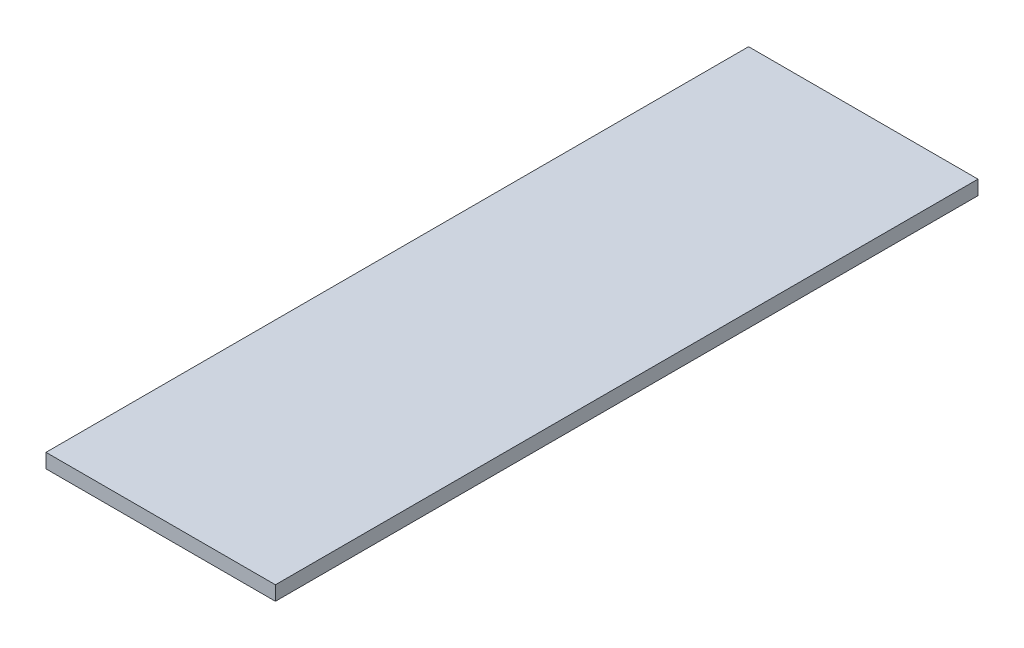
ISO-10303-21;
HEADER;
FILE_DESCRIPTION(('STEP AP214'),'2;1');
FILE_NAME('part.step','',(''),(''),'','','');
FILE_SCHEMA(('AUTOMOTIVE_DESIGN { 1 0 10303 214 1 1 1 1 }'));
ENDSEC;
DATA;
#1=APPLICATION_CONTEXT('core data for automotive mechanical design processes');
#2=APPLICATION_PROTOCOL_DEFINITION('international standard','automotive_design',2000,#1);
#3=PRODUCT_CONTEXT('',#1,'mechanical');
#4=PRODUCT('Part','Part','',(#3));
#5=PRODUCT_RELATED_PRODUCT_CATEGORY('part','',(#4));
#6=PRODUCT_DEFINITION_FORMATION('','',#4);
#7=PRODUCT_DEFINITION_CONTEXT('part definition',#1,'design');
#8=PRODUCT_DEFINITION('design','',#6,#7);
#9=PRODUCT_DEFINITION_SHAPE('','',#8);
#10=(LENGTH_UNIT() NAMED_UNIT(*) SI_UNIT(.MILLI.,.METRE.));
#11=(NAMED_UNIT(*) PLANE_ANGLE_UNIT() SI_UNIT($,.RADIAN.));
#12=(NAMED_UNIT(*) SI_UNIT($,.STERADIAN.) SOLID_ANGLE_UNIT());
#13=UNCERTAINTY_MEASURE_WITH_UNIT(LENGTH_MEASURE(1.E-05),#10,'distance_accuracy_value','');
#14=(GEOMETRIC_REPRESENTATION_CONTEXT(3) GLOBAL_UNCERTAINTY_ASSIGNED_CONTEXT((#13)) GLOBAL_UNIT_ASSIGNED_CONTEXT((#10,
#11,#12)) REPRESENTATION_CONTEXT('',''));
#15=CARTESIAN_POINT('',(0.,0.,0.));
#16=DIRECTION('',(0.,0.,1.));
#17=DIRECTION('',(1.,0.,0.));
#18=AXIS2_PLACEMENT_3D('',#15,#16,#17);
#19=CARTESIAN_POINT('',(1199.99999999998,-150.,-300.000000000034));
#20=DIRECTION('',(1.,0.,0.));
#21=DIRECTION('',(0.,0.,-1.));
#22=AXIS2_PLACEMENT_3D('',#19,#20,#21);
#23=PLANE('',#22);
#24=DIRECTION('',(0.,0.,-1.));
#25=VECTOR('',#24,1.);
#26=CARTESIAN_POINT('',(1199.99999999998,0.,-300.000000000034));
#27=LINE('',#26,#25);
#28=CARTESIAN_POINT('',(1199.99999999998,0.,7049.99999999999));
#29=VERTEX_POINT('',#28);
#30=CARTESIAN_POINT('',(1199.99999999998,0.,-300.000000000034));
#31=VERTEX_POINT('',#30);
#32=EDGE_CURVE('E107',#29,#31,#27,.T.);
#33=ORIENTED_EDGE('',*,*,#32,.F.);
#34=DIRECTION('',(0.,1.,0.));
#35=VECTOR('',#34,1.);
#36=CARTESIAN_POINT('',(1199.99999999998,-150.,7049.99999999999));
#37=LINE('',#36,#35);
#38=CARTESIAN_POINT('',(1199.99999999998,-150.,7049.99999999999));
#39=VERTEX_POINT('',#38);
#40=EDGE_CURVE('E11',#39,#29,#37,.T.);
#41=ORIENTED_EDGE('',*,*,#40,.F.);
#42=DIRECTION('',(0.,0.,-1.));
#43=VECTOR('',#42,1.);
#44=CARTESIAN_POINT('',(1199.99999999998,-150.,-300.000000000034));
#45=LINE('',#44,#43);
#46=CARTESIAN_POINT('',(1199.99999999998,-150.,-300.000000000034));
#47=VERTEX_POINT('',#46);
#48=EDGE_CURVE('E98',#39,#47,#45,.T.);
#49=ORIENTED_EDGE('',*,*,#48,.T.);
#50=DIRECTION('',(0.,1.,0.));
#51=VECTOR('',#50,1.);
#52=CARTESIAN_POINT('',(1199.99999999998,-150.,-300.000000000034));
#53=LINE('',#52,#51);
#54=EDGE_CURVE('E39',#47,#31,#53,.T.);
#55=ORIENTED_EDGE('',*,*,#54,.T.);
#56=EDGE_LOOP('',(#33,#41,#49,#55));
#57=FACE_BOUND('',#56,.T.);
#58=ADVANCED_FACE('F36',(#57),#23,.T.);
#59=CARTESIAN_POINT('',(1199.99999999998,-150.,7049.99999999999));
#60=DIRECTION('',(0.,0.,1.));
#61=DIRECTION('',(1.,0.,0.));
#62=AXIS2_PLACEMENT_3D('',#59,#60,#61);
#63=PLANE('',#62);
#64=DIRECTION('',(1.,0.,0.));
#65=VECTOR('',#64,1.);
#66=CARTESIAN_POINT('',(1199.99999999998,0.,7049.99999999999));
#67=LINE('',#66,#65);
#68=CARTESIAN_POINT('',(-1199.99999999998,0.,7049.99999999999));
#69=VERTEX_POINT('',#68);
#70=EDGE_CURVE('E102',#69,#29,#67,.T.);
#71=ORIENTED_EDGE('',*,*,#70,.F.);
#72=DIRECTION('',(0.,1.,0.));
#73=VECTOR('',#72,1.);
#74=CARTESIAN_POINT('',(-1199.99999999998,-150.,7049.99999999999));
#75=LINE('',#74,#73);
#76=CARTESIAN_POINT('',(-1199.99999999998,-150.,7049.99999999999));
#77=VERTEX_POINT('',#76);
#78=EDGE_CURVE('E46',#77,#69,#75,.T.);
#79=ORIENTED_EDGE('',*,*,#78,.F.);
#80=DIRECTION('',(1.,0.,0.));
#81=VECTOR('',#80,1.);
#82=CARTESIAN_POINT('',(1199.99999999998,-150.,7049.99999999999));
#83=LINE('',#82,#81);
#84=EDGE_CURVE('E93',#77,#39,#83,.T.);
#85=ORIENTED_EDGE('',*,*,#84,.T.);
#86=ORIENTED_EDGE('',*,*,#40,.T.);
#87=EDGE_LOOP('',(#71,#79,#85,#86));
#88=FACE_BOUND('',#87,.T.);
#89=ADVANCED_FACE('F129',(#88),#63,.T.);
#90=CARTESIAN_POINT('',(-1199.99999999998,-150.,-300.000000000034));
#91=DIRECTION('',(-1.,0.,0.));
#92=DIRECTION('',(0.,0.,1.));
#93=AXIS2_PLACEMENT_3D('',#90,#91,#92);
#94=PLANE('',#93);
#95=DIRECTION('',(0.,0.,1.));
#96=VECTOR('',#95,1.);
#97=CARTESIAN_POINT('',(-1199.99999999998,0.,-300.000000000034));
#98=LINE('',#97,#96);
#99=CARTESIAN_POINT('',(-1199.99999999998,0.,-300.000000000034));
#100=VERTEX_POINT('',#99);
#101=EDGE_CURVE('E87',#100,#69,#98,.T.);
#102=ORIENTED_EDGE('',*,*,#101,.F.);
#103=DIRECTION('',(0.,1.,0.));
#104=VECTOR('',#103,1.);
#105=CARTESIAN_POINT('',(-1199.99999999998,-150.,-300.000000000034));
#106=LINE('',#105,#104);
#107=CARTESIAN_POINT('',(-1199.99999999998,-150.,-300.000000000034));
#108=VERTEX_POINT('',#107);
#109=EDGE_CURVE('E82',#108,#100,#106,.T.);
#110=ORIENTED_EDGE('',*,*,#109,.F.);
#111=DIRECTION('',(0.,0.,1.));
#112=VECTOR('',#111,1.);
#113=CARTESIAN_POINT('',(-1199.99999999998,-150.,-300.000000000034));
#114=LINE('',#113,#112);
#115=EDGE_CURVE('E85',#108,#77,#114,.T.);
#116=ORIENTED_EDGE('',*,*,#115,.T.);
#117=ORIENTED_EDGE('',*,*,#78,.T.);
#118=EDGE_LOOP('',(#102,#110,#116,#117));
#119=FACE_BOUND('',#118,.T.);
#120=ADVANCED_FACE('F84',(#119),#94,.T.);
#121=CARTESIAN_POINT('',(1199.99999999998,-150.,-300.000000000034));
#122=DIRECTION('',(0.,0.,-1.));
#123=DIRECTION('',(-1.,0.,0.));
#124=AXIS2_PLACEMENT_3D('',#121,#122,#123);
#125=PLANE('',#124);
#126=DIRECTION('',(-1.,0.,0.));
#127=VECTOR('',#126,1.);
#128=CARTESIAN_POINT('',(1199.99999999998,0.,-300.000000000034));
#129=LINE('',#128,#127);
#130=EDGE_CURVE('E111',#31,#100,#129,.T.);
#131=ORIENTED_EDGE('',*,*,#130,.F.);
#132=ORIENTED_EDGE('',*,*,#54,.F.);
#133=DIRECTION('',(-1.,0.,0.));
#134=VECTOR('',#133,1.);
#135=CARTESIAN_POINT('',(1199.99999999998,-150.,-300.000000000034));
#136=LINE('',#135,#134);
#137=EDGE_CURVE('E92',#47,#108,#136,.T.);
#138=ORIENTED_EDGE('',*,*,#137,.T.);
#139=ORIENTED_EDGE('',*,*,#109,.T.);
#140=EDGE_LOOP('',(#131,#132,#138,#139));
#141=FACE_BOUND('',#140,.T.);
#142=ADVANCED_FACE('F96',(#141),#125,.T.);
#143=CARTESIAN_POINT('',(0.,-150.,0.));
#144=DIRECTION('',(0.,-1.,0.));
#145=DIRECTION('',(0.,0.,-1.));
#146=AXIS2_PLACEMENT_3D('',#143,#144,#145);
#147=PLANE('',#146);
#148=ORIENTED_EDGE('',*,*,#48,.F.);
#149=ORIENTED_EDGE('',*,*,#84,.F.);
#150=ORIENTED_EDGE('',*,*,#115,.F.);
#151=ORIENTED_EDGE('',*,*,#137,.F.);
#152=EDGE_LOOP('',(#148,#149,#150,#151));
#153=FACE_BOUND('',#152,.T.);
#154=ADVANCED_FACE('F91',(#153),#147,.T.);
#155=CARTESIAN_POINT('',(0.,0.,0.));
#156=DIRECTION('',(0.,-1.,0.));
#157=DIRECTION('',(0.,0.,-1.));
#158=AXIS2_PLACEMENT_3D('',#155,#156,#157);
#159=PLANE('',#158);
#160=ORIENTED_EDGE('',*,*,#32,.T.);
#161=ORIENTED_EDGE('',*,*,#130,.T.);
#162=ORIENTED_EDGE('',*,*,#101,.T.);
#163=ORIENTED_EDGE('',*,*,#70,.T.);
#164=EDGE_LOOP('',(#160,#161,#162,#163));
#165=FACE_BOUND('',#164,.T.);
#166=ADVANCED_FACE('F128',(#165),#159,.F.);
#167=CLOSED_SHELL('',(#58,#89,#120,#142,#154,#166));
#168=MANIFOLD_SOLID_BREP('B2',#167);
#169=ADVANCED_BREP_SHAPE_REPRESENTATION('',(#18,#168),#14);
#170=SHAPE_DEFINITION_REPRESENTATION(#9,#169);
ENDSEC;
END-ISO-10303-21;
